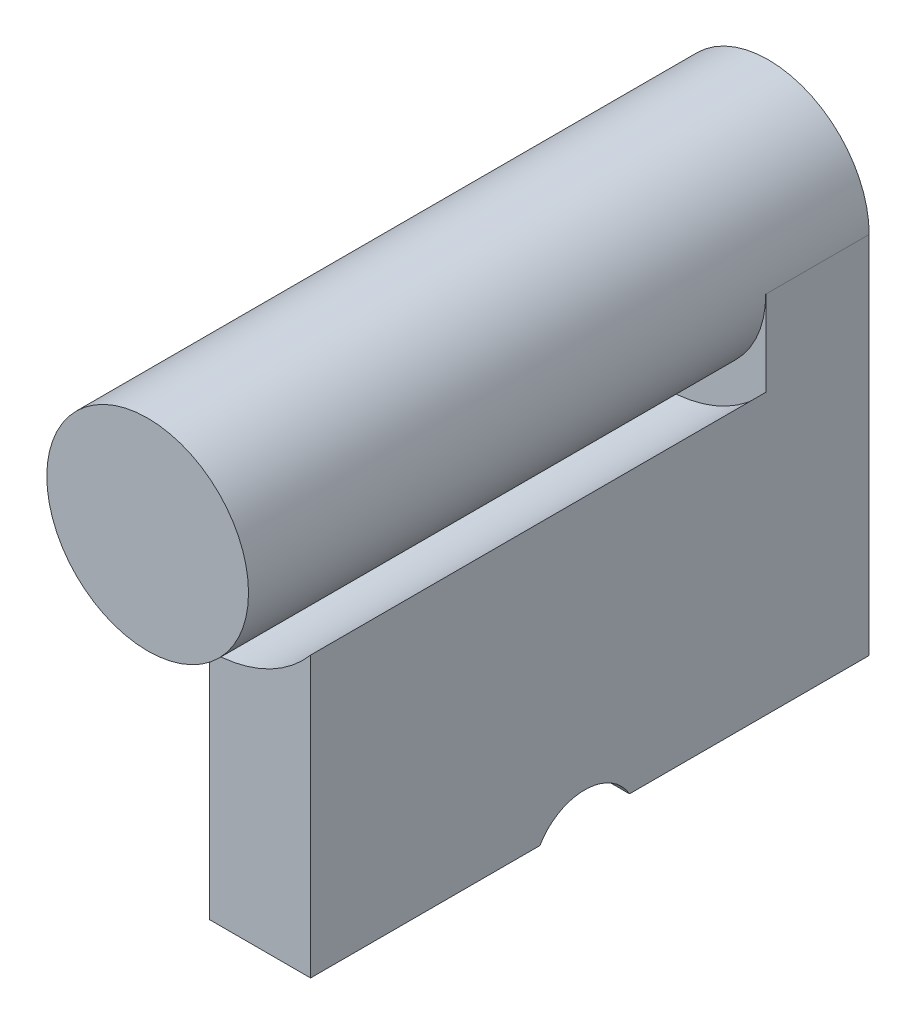
ISO-10303-21;
HEADER;
FILE_DESCRIPTION(('STEP AP214'),'2;1');
FILE_NAME('part.step','',(''),(''),'','','');
FILE_SCHEMA(('AUTOMOTIVE_DESIGN { 1 0 10303 214 1 1 1 1 }'));
ENDSEC;
DATA;
#1=APPLICATION_CONTEXT('core data for automotive mechanical design processes');
#2=APPLICATION_PROTOCOL_DEFINITION('international standard','automotive_design',2000,#1);
#3=PRODUCT_CONTEXT('',#1,'mechanical');
#4=PRODUCT('Part','Part','',(#3));
#5=PRODUCT_RELATED_PRODUCT_CATEGORY('part','',(#4));
#6=PRODUCT_DEFINITION_FORMATION('','',#4);
#7=PRODUCT_DEFINITION_CONTEXT('part definition',#1,'design');
#8=PRODUCT_DEFINITION('design','',#6,#7);
#9=PRODUCT_DEFINITION_SHAPE('','',#8);
#10=(LENGTH_UNIT() NAMED_UNIT(*) SI_UNIT(.MILLI.,.METRE.));
#11=(NAMED_UNIT(*) PLANE_ANGLE_UNIT() SI_UNIT($,.RADIAN.));
#12=(NAMED_UNIT(*) SI_UNIT($,.STERADIAN.) SOLID_ANGLE_UNIT());
#13=UNCERTAINTY_MEASURE_WITH_UNIT(LENGTH_MEASURE(1.E-05),#10,'distance_accuracy_value','');
#14=(GEOMETRIC_REPRESENTATION_CONTEXT(3) GLOBAL_UNCERTAINTY_ASSIGNED_CONTEXT((#13)) GLOBAL_UNIT_ASSIGNED_CONTEXT((#10,
#11,#12)) REPRESENTATION_CONTEXT('',''));
#15=CARTESIAN_POINT('',(0.,0.,0.));
#16=DIRECTION('',(0.,0.,1.));
#17=DIRECTION('',(1.,0.,0.));
#18=AXIS2_PLACEMENT_3D('',#15,#16,#17);
#19=CARTESIAN_POINT('',(34.,-15.1,11.));
#20=DIRECTION('',(-1.,0.,0.));
#21=DIRECTION('',(0.,0.,1.));
#22=AXIS2_PLACEMENT_3D('',#19,#20,#21);
#23=CYLINDRICAL_SURFACE('',#22,2.);
#24=CARTESIAN_POINT('',(2.,-15.1,11.));
#25=DIRECTION('',(-1.,0.,0.));
#26=DIRECTION('',(0.,0.,1.));
#27=AXIS2_PLACEMENT_3D('',#24,#25,#26);
#28=CIRCLE('',#27,2.);
#29=CARTESIAN_POINT('',(2.,-14.1,9.26794919243113));
#30=VERTEX_POINT('',#29);
#31=CARTESIAN_POINT('',(2.,-14.1,12.7320508075689));
#32=VERTEX_POINT('',#31);
#33=EDGE_CURVE('E45',#30,#32,#28,.F.);
#34=ORIENTED_EDGE('',*,*,#33,.F.);
#35=DIRECTION('',(-1.,0.,0.));
#36=VECTOR('',#35,1.);
#37=CARTESIAN_POINT('',(34.,-14.1,9.26794919243113));
#38=LINE('',#37,#36);
#39=CARTESIAN_POINT('',(3.9,-14.1,9.26794919243113));
#40=VERTEX_POINT('',#39);
#41=EDGE_CURVE('E169',#40,#30,#38,.T.);
#42=ORIENTED_EDGE('',*,*,#41,.F.);
#43=CARTESIAN_POINT('',(3.9,-15.1,11.));
#44=DIRECTION('',(1.,0.,0.));
#45=DIRECTION('',(0.,0.,-1.));
#46=AXIS2_PLACEMENT_3D('',#43,#44,#45);
#47=CIRCLE('',#46,2.);
#48=CARTESIAN_POINT('',(3.9,-14.1,12.7320508075689));
#49=VERTEX_POINT('',#48);
#50=EDGE_CURVE('E178',#40,#49,#47,.T.);
#51=ORIENTED_EDGE('',*,*,#50,.T.);
#52=DIRECTION('',(-1.,0.,0.));
#53=VECTOR('',#52,1.);
#54=CARTESIAN_POINT('',(34.,-14.1,12.7320508075689));
#55=LINE('',#54,#53);
#56=EDGE_CURVE('E60',#32,#49,#55,.F.);
#57=ORIENTED_EDGE('',*,*,#56,.F.);
#58=EDGE_LOOP('',(#34,#42,#51,#57));
#59=FACE_BOUND('',#58,.T.);
#60=ADVANCED_FACE('F37',(#59),#23,.F.);
#61=CARTESIAN_POINT('',(3.9,-14.1,4.));
#62=DIRECTION('',(0.,1.,0.));
#63=DIRECTION('',(0.,0.,1.));
#64=AXIS2_PLACEMENT_3D('',#61,#62,#63);
#65=PLANE('',#64);
#66=DIRECTION('',(0.,0.,1.));
#67=VECTOR('',#66,1.);
#68=CARTESIAN_POINT('',(2.,-14.1,4.));
#69=LINE('',#68,#67);
#70=CARTESIAN_POINT('',(2.,-14.1,8.44828939238948));
#71=VERTEX_POINT('',#70);
#72=EDGE_CURVE('E52',#71,#30,#69,.T.);
#73=ORIENTED_EDGE('',*,*,#72,.F.);
#74=DIRECTION('',(-1.,0.,0.));
#75=VECTOR('',#74,1.);
#76=CARTESIAN_POINT('',(2.,-14.1,8.44828939238948));
#77=LINE('',#76,#75);
#78=CARTESIAN_POINT('',(0.,-14.1,8.44828939238948));
#79=VERTEX_POINT('',#78);
#80=EDGE_CURVE('E180',#71,#79,#77,.T.);
#81=ORIENTED_EDGE('',*,*,#80,.T.);
#82=DIRECTION('',(0.,0.,-1.));
#83=VECTOR('',#82,1.);
#84=CARTESIAN_POINT('',(0.,-14.1,4.));
#85=LINE('',#84,#83);
#86=CARTESIAN_POINT('',(0.,-14.1,0.));
#87=VERTEX_POINT('',#86);
#88=EDGE_CURVE('E149',#79,#87,#85,.T.);
#89=ORIENTED_EDGE('',*,*,#88,.T.);
#90=DIRECTION('',(-1.,0.,0.));
#91=VECTOR('',#90,1.);
#92=CARTESIAN_POINT('',(3.9,-14.1,0.));
#93=LINE('',#92,#91);
#94=CARTESIAN_POINT('',(3.9,-14.1,0.));
#95=VERTEX_POINT('',#94);
#96=EDGE_CURVE('E158',#95,#87,#93,.T.);
#97=ORIENTED_EDGE('',*,*,#96,.F.);
#98=DIRECTION('',(0.,0.,-1.));
#99=VECTOR('',#98,1.);
#100=CARTESIAN_POINT('',(3.9,-14.1,4.));
#101=LINE('',#100,#99);
#102=EDGE_CURVE('E142',#40,#95,#101,.T.);
#103=ORIENTED_EDGE('',*,*,#102,.F.);
#104=ORIENTED_EDGE('',*,*,#41,.T.);
#105=EDGE_LOOP('',(#73,#81,#89,#97,#103,#104));
#106=FACE_BOUND('',#105,.T.);
#107=ADVANCED_FACE('F219',(#106),#65,.F.);
#108=CARTESIAN_POINT('',(0.,0.,24.));
#109=DIRECTION('',(0.,0.,-1.));
#110=DIRECTION('',(-1.,0.,0.));
#111=AXIS2_PLACEMENT_3D('',#108,#109,#110);
#112=CYLINDRICAL_SURFACE('',#111,3.9);
#113=CARTESIAN_POINT('',(0.,0.,4.));
#114=DIRECTION('',(0.,0.,-1.));
#115=DIRECTION('',(0.,1.,0.));
#116=AXIS2_PLACEMENT_3D('',#113,#114,#115);
#117=CIRCLE('',#116,3.9);
#118=CARTESIAN_POINT('',(3.9,0.,4.));
#119=VERTEX_POINT('',#118);
#120=CARTESIAN_POINT('',(0.,-3.9,4.));
#121=VERTEX_POINT('',#120);
#122=EDGE_CURVE('E133',#119,#121,#117,.T.);
#123=ORIENTED_EDGE('',*,*,#122,.F.);
#124=DIRECTION('',(0.,0.,1.));
#125=VECTOR('',#124,1.);
#126=CARTESIAN_POINT('',(3.9,0.,0.));
#127=LINE('',#126,#125);
#128=CARTESIAN_POINT('',(3.9,0.,0.));
#129=VERTEX_POINT('',#128);
#130=EDGE_CURVE('E130',#129,#119,#127,.T.);
#131=ORIENTED_EDGE('',*,*,#130,.F.);
#132=CARTESIAN_POINT('',(0.,0.,0.));
#133=DIRECTION('',(0.,0.,1.));
#134=DIRECTION('',(1.,0.,0.));
#135=AXIS2_PLACEMENT_3D('',#132,#133,#134);
#136=CIRCLE('',#135,3.9);
#137=CARTESIAN_POINT('',(0.,-3.9,0.));
#138=VERTEX_POINT('',#137);
#139=EDGE_CURVE('E116',#129,#138,#136,.T.);
#140=ORIENTED_EDGE('',*,*,#139,.T.);
#141=DIRECTION('',(0.,0.,-1.));
#142=VECTOR('',#141,1.);
#143=CARTESIAN_POINT('',(0.,-3.9,24.));
#144=LINE('',#143,#142);
#145=EDGE_CURVE('E127',#121,#138,#144,.T.);
#146=ORIENTED_EDGE('',*,*,#145,.F.);
#147=EDGE_LOOP('',(#123,#131,#140,#146));
#148=FACE_BOUND('',#147,.T.);
#149=CARTESIAN_POINT('',(0.,0.,24.));
#150=DIRECTION('',(0.,0.,1.));
#151=DIRECTION('',(1.,0.,0.));
#152=AXIS2_PLACEMENT_3D('',#149,#150,#151);
#153=CIRCLE('',#152,3.9);
#154=CARTESIAN_POINT('',(3.9,0.,24.));
#155=VERTEX_POINT('',#154);
#156=EDGE_CURVE('E126',#155,#155,#153,.T.);
#157=ORIENTED_EDGE('',*,*,#156,.F.);
#158=EDGE_LOOP('',(#157));
#159=FACE_BOUND('',#158,.T.);
#160=ADVANCED_FACE('F39',(#148,#159),#112,.T.);
#161=CARTESIAN_POINT('',(0.,0.,24.));
#162=DIRECTION('',(0.,0.,1.));
#163=DIRECTION('',(1.,0.,0.));
#164=AXIS2_PLACEMENT_3D('',#161,#162,#163);
#165=PLANE('',#164);
#166=ORIENTED_EDGE('',*,*,#156,.T.);
#167=EDGE_LOOP('',(#166));
#168=FACE_BOUND('',#167,.T.);
#169=ADVANCED_FACE('F246',(#168),#165,.T.);
#170=CARTESIAN_POINT('',(0.,0.,0.));
#171=DIRECTION('',(0.,0.,1.));
#172=DIRECTION('',(1.,0.,0.));
#173=AXIS2_PLACEMENT_3D('',#170,#171,#172);
#174=PLANE('',#173);
#175=ORIENTED_EDGE('',*,*,#139,.F.);
#176=DIRECTION('',(0.,1.,0.));
#177=VECTOR('',#176,1.);
#178=CARTESIAN_POINT('',(3.9,3.9,0.));
#179=LINE('',#178,#177);
#180=EDGE_CURVE('E121',#95,#129,#179,.T.);
#181=ORIENTED_EDGE('',*,*,#180,.F.);
#182=ORIENTED_EDGE('',*,*,#96,.T.);
#183=DIRECTION('',(0.,1.,0.));
#184=VECTOR('',#183,1.);
#185=CARTESIAN_POINT('',(0.,3.9,0.));
#186=LINE('',#185,#184);
#187=EDGE_CURVE('E123',#87,#138,#186,.T.);
#188=ORIENTED_EDGE('',*,*,#187,.T.);
#189=EDGE_LOOP('',(#175,#181,#182,#188));
#190=FACE_BOUND('',#189,.T.);
#191=ADVANCED_FACE('F118',(#190),#174,.F.);
#192=CARTESIAN_POINT('',(3.9,0.,0.));
#193=DIRECTION('',(1.,0.,0.));
#194=DIRECTION('',(0.,0.,-1.));
#195=AXIS2_PLACEMENT_3D('',#192,#193,#194);
#196=PLANE('',#195);
#197=ORIENTED_EDGE('',*,*,#130,.T.);
#198=DIRECTION('',(0.,-1.,0.));
#199=VECTOR('',#198,1.);
#200=CARTESIAN_POINT('',(3.9,3.9,4.));
#201=LINE('',#200,#199);
#202=CARTESIAN_POINT('',(3.9,-3.286335345031,4.));
#203=VERTEX_POINT('',#202);
#204=EDGE_CURVE('E144',#119,#203,#201,.T.);
#205=ORIENTED_EDGE('',*,*,#204,.T.);
#206=DIRECTION('',(0.,0.,-1.));
#207=VECTOR('',#206,1.);
#208=CARTESIAN_POINT('',(3.9,-3.286335345031,21.6));
#209=LINE('',#208,#207);
#210=CARTESIAN_POINT('',(3.9,-3.286335345031,21.6));
#211=VERTEX_POINT('',#210);
#212=EDGE_CURVE('E195',#211,#203,#209,.T.);
#213=ORIENTED_EDGE('',*,*,#212,.F.);
#214=DIRECTION('',(0.,1.,0.));
#215=VECTOR('',#214,1.);
#216=CARTESIAN_POINT('',(3.9,0.,21.6));
#217=LINE('',#216,#215);
#218=CARTESIAN_POINT('',(3.9,-14.1,21.6));
#219=VERTEX_POINT('',#218);
#220=EDGE_CURVE('E184',#219,#211,#217,.T.);
#221=ORIENTED_EDGE('',*,*,#220,.F.);
#222=EDGE_CURVE('E155',#219,#49,#101,.T.);
#223=ORIENTED_EDGE('',*,*,#222,.T.);
#224=ORIENTED_EDGE('',*,*,#50,.F.);
#225=ORIENTED_EDGE('',*,*,#102,.T.);
#226=ORIENTED_EDGE('',*,*,#180,.T.);
#227=EDGE_LOOP('',(#197,#205,#213,#221,#223,#224,#225,#226));
#228=FACE_BOUND('',#227,.T.);
#229=ADVANCED_FACE('F139',(#228),#196,.T.);
#230=CARTESIAN_POINT('',(0.,0.,0.));
#231=DIRECTION('',(1.,0.,0.));
#232=DIRECTION('',(0.,0.,-1.));
#233=AXIS2_PLACEMENT_3D('',#230,#231,#232);
#234=PLANE('',#233);
#235=ORIENTED_EDGE('',*,*,#88,.F.);
#236=CARTESIAN_POINT('',(0.,-15.1,11.0100270838794));
#237=DIRECTION('',(-1.,0.,0.));
#238=DIRECTION('',(0.,0.,1.));
#239=AXIS2_PLACEMENT_3D('',#236,#237,#238);
#240=CIRCLE('',#239,2.75);
#241=CARTESIAN_POINT('',(0.,-14.1,13.5717647753693));
#242=VERTEX_POINT('',#241);
#243=EDGE_CURVE('E137',#242,#79,#240,.T.);
#244=ORIENTED_EDGE('',*,*,#243,.F.);
#245=CARTESIAN_POINT('',(0.,-14.1,21.6));
#246=VERTEX_POINT('',#245);
#247=EDGE_CURVE('E145',#246,#242,#85,.T.);
#248=ORIENTED_EDGE('',*,*,#247,.F.);
#249=DIRECTION('',(0.,-1.,0.));
#250=VECTOR('',#249,1.);
#251=CARTESIAN_POINT('',(0.,0.,21.6));
#252=LINE('',#251,#250);
#253=CARTESIAN_POINT('',(0.,-5.1,21.6));
#254=VERTEX_POINT('',#253);
#255=EDGE_CURVE('E193',#254,#246,#252,.T.);
#256=ORIENTED_EDGE('',*,*,#255,.F.);
#257=DIRECTION('',(0.,0.,-1.));
#258=VECTOR('',#257,1.);
#259=CARTESIAN_POINT('',(0.,-5.1,21.6));
#260=LINE('',#259,#258);
#261=CARTESIAN_POINT('',(0.,-5.1,4.));
#262=VERTEX_POINT('',#261);
#263=EDGE_CURVE('E152',#254,#262,#260,.T.);
#264=ORIENTED_EDGE('',*,*,#263,.T.);
#265=DIRECTION('',(0.,-1.,0.));
#266=VECTOR('',#265,1.);
#267=CARTESIAN_POINT('',(0.,3.9,4.));
#268=LINE('',#267,#266);
#269=EDGE_CURVE('E160',#121,#262,#268,.T.);
#270=ORIENTED_EDGE('',*,*,#269,.F.);
#271=ORIENTED_EDGE('',*,*,#145,.T.);
#272=ORIENTED_EDGE('',*,*,#187,.F.);
#273=EDGE_LOOP('',(#235,#244,#248,#256,#264,#270,#271,#272));
#274=FACE_BOUND('',#273,.T.);
#275=ADVANCED_FACE('F208',(#274),#234,.F.);
#276=CARTESIAN_POINT('',(3.9,3.9,4.));
#277=DIRECTION('',(0.,0.,-1.));
#278=DIRECTION('',(0.,1.,0.));
#279=AXIS2_PLACEMENT_3D('',#276,#277,#278);
#280=PLANE('',#279);
#281=ORIENTED_EDGE('',*,*,#269,.T.);
#282=CARTESIAN_POINT('',(0.,0.,4.));
#283=DIRECTION('',(0.,0.,1.));
#284=DIRECTION('',(1.,0.,0.));
#285=AXIS2_PLACEMENT_3D('',#282,#283,#284);
#286=CIRCLE('',#285,5.1);
#287=EDGE_CURVE('E179',#262,#203,#286,.T.);
#288=ORIENTED_EDGE('',*,*,#287,.T.);
#289=ORIENTED_EDGE('',*,*,#204,.F.);
#290=ORIENTED_EDGE('',*,*,#122,.T.);
#291=EDGE_LOOP('',(#281,#288,#289,#290));
#292=FACE_BOUND('',#291,.T.);
#293=ADVANCED_FACE('F211',(#292),#280,.F.);
#294=ORIENTED_EDGE('',*,*,#247,.T.);
#295=DIRECTION('',(-1.,0.,0.));
#296=VECTOR('',#295,1.);
#297=CARTESIAN_POINT('',(2.,-14.1,13.5717647753693));
#298=LINE('',#297,#296);
#299=CARTESIAN_POINT('',(2.,-14.1,13.5717647753693));
#300=VERTEX_POINT('',#299);
#301=EDGE_CURVE('E11',#242,#300,#298,.F.);
#302=ORIENTED_EDGE('',*,*,#301,.T.);
#303=DIRECTION('',(0.,0.,1.));
#304=VECTOR('',#303,1.);
#305=CARTESIAN_POINT('',(2.,-14.1,4.));
#306=LINE('',#305,#304);
#307=EDGE_CURVE('E172',#32,#300,#306,.T.);
#308=ORIENTED_EDGE('',*,*,#307,.F.);
#309=ORIENTED_EDGE('',*,*,#56,.T.);
#310=ORIENTED_EDGE('',*,*,#222,.F.);
#311=DIRECTION('',(1.,0.,0.));
#312=VECTOR('',#311,1.);
#313=CARTESIAN_POINT('',(0.,-14.1,21.6));
#314=LINE('',#313,#312);
#315=EDGE_CURVE('E187',#246,#219,#314,.T.);
#316=ORIENTED_EDGE('',*,*,#315,.F.);
#317=EDGE_LOOP('',(#294,#302,#308,#309,#310,#316));
#318=FACE_BOUND('',#317,.T.);
#319=ADVANCED_FACE('F175',(#318),#65,.F.);
#320=CARTESIAN_POINT('',(0.,0.,21.6));
#321=DIRECTION('',(0.,0.,-1.));
#322=DIRECTION('',(-1.,0.,0.));
#323=AXIS2_PLACEMENT_3D('',#320,#321,#322);
#324=CYLINDRICAL_SURFACE('',#323,5.1);
#325=ORIENTED_EDGE('',*,*,#287,.F.);
#326=ORIENTED_EDGE('',*,*,#263,.F.);
#327=CARTESIAN_POINT('',(0.,0.,21.6));
#328=DIRECTION('',(0.,0.,1.));
#329=DIRECTION('',(1.,0.,0.));
#330=AXIS2_PLACEMENT_3D('',#327,#328,#329);
#331=CIRCLE('',#330,5.1);
#332=EDGE_CURVE('E197',#254,#211,#331,.T.);
#333=ORIENTED_EDGE('',*,*,#332,.T.);
#334=ORIENTED_EDGE('',*,*,#212,.T.);
#335=EDGE_LOOP('',(#325,#326,#333,#334));
#336=FACE_BOUND('',#335,.T.);
#337=ADVANCED_FACE('F209',(#336),#324,.F.);
#338=CARTESIAN_POINT('',(0.,0.,21.6));
#339=DIRECTION('',(0.,0.,1.));
#340=DIRECTION('',(1.,0.,0.));
#341=AXIS2_PLACEMENT_3D('',#338,#339,#340);
#342=PLANE('',#341);
#343=ORIENTED_EDGE('',*,*,#332,.F.);
#344=ORIENTED_EDGE('',*,*,#255,.T.);
#345=ORIENTED_EDGE('',*,*,#315,.T.);
#346=ORIENTED_EDGE('',*,*,#220,.T.);
#347=EDGE_LOOP('',(#343,#344,#345,#346));
#348=FACE_BOUND('',#347,.T.);
#349=ADVANCED_FACE('F191',(#348),#342,.T.);
#350=CARTESIAN_POINT('',(2.,-15.1,11.0100270838794));
#351=DIRECTION('',(-1.,0.,0.));
#352=DIRECTION('',(0.,0.,1.));
#353=AXIS2_PLACEMENT_3D('',#350,#351,#352);
#354=CYLINDRICAL_SURFACE('',#353,2.75);
#355=CARTESIAN_POINT('',(2.,-15.1,11.0100270838794));
#356=DIRECTION('',(-1.,0.,0.));
#357=DIRECTION('',(0.,0.,1.));
#358=AXIS2_PLACEMENT_3D('',#355,#356,#357);
#359=CIRCLE('',#358,2.75);
#360=EDGE_CURVE('E176',#300,#71,#359,.T.);
#361=ORIENTED_EDGE('',*,*,#360,.F.);
#362=ORIENTED_EDGE('',*,*,#301,.F.);
#363=ORIENTED_EDGE('',*,*,#243,.T.);
#364=ORIENTED_EDGE('',*,*,#80,.F.);
#365=EDGE_LOOP('',(#361,#362,#363,#364));
#366=FACE_BOUND('',#365,.T.);
#367=ADVANCED_FACE('F221',(#366),#354,.F.);
#368=CARTESIAN_POINT('',(2.,-15.1,11.0100270838794));
#369=DIRECTION('',(-1.,0.,0.));
#370=DIRECTION('',(0.,0.,1.));
#371=AXIS2_PLACEMENT_3D('',#368,#369,#370);
#372=PLANE('',#371);
#373=ORIENTED_EDGE('',*,*,#72,.T.);
#374=ORIENTED_EDGE('',*,*,#33,.T.);
#375=ORIENTED_EDGE('',*,*,#307,.T.);
#376=ORIENTED_EDGE('',*,*,#360,.T.);
#377=EDGE_LOOP('',(#373,#374,#375,#376));
#378=FACE_BOUND('',#377,.T.);
#379=ADVANCED_FACE('F171',(#378),#372,.T.);
#380=CLOSED_SHELL('',(#60,#107,#160,#169,#191,#229,#275,#293,#319,#337,#349,#367,#379));
#381=MANIFOLD_SOLID_BREP('B2',#380);
#382=ADVANCED_BREP_SHAPE_REPRESENTATION('',(#18,#381),#14);
#383=SHAPE_DEFINITION_REPRESENTATION(#9,#382);
ENDSEC;
END-ISO-10303-21;
